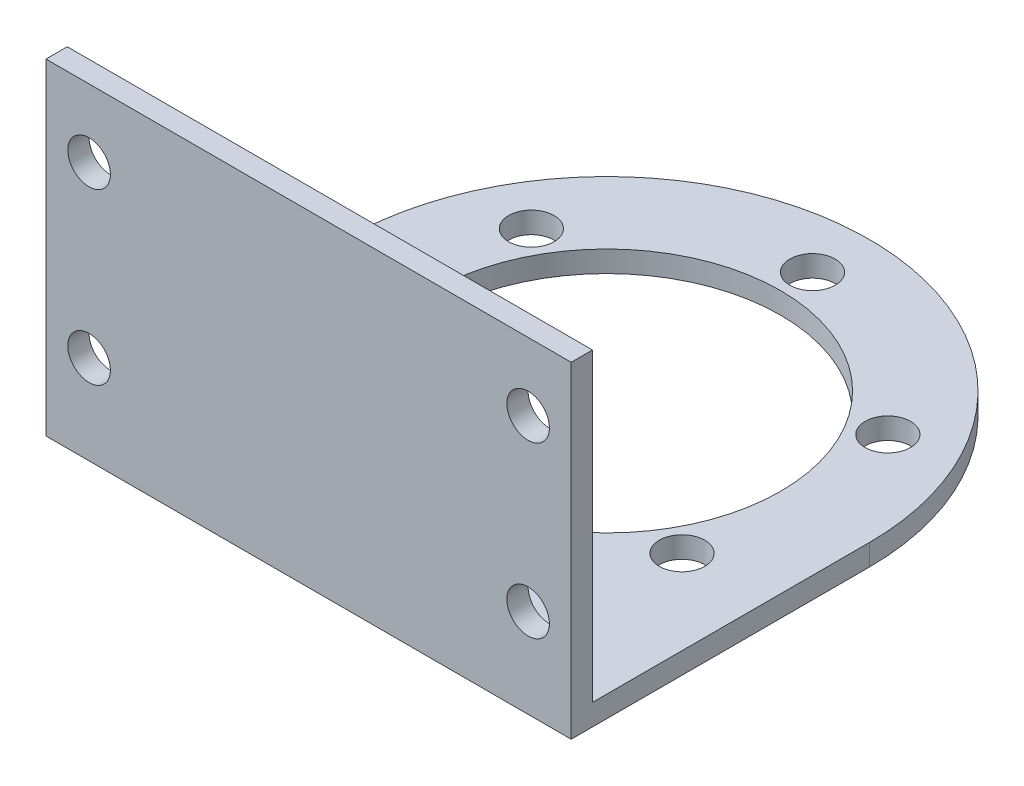
ISO-10303-21;
HEADER;
FILE_DESCRIPTION(('STEP AP214'),'2;1');
FILE_NAME('part.step','',(''),(''),'','','');
FILE_SCHEMA(('AUTOMOTIVE_DESIGN { 1 0 10303 214 1 1 1 1 }'));
ENDSEC;
DATA;
#1=APPLICATION_CONTEXT('core data for automotive mechanical design processes');
#2=APPLICATION_PROTOCOL_DEFINITION('international standard','automotive_design',2000,#1);
#3=PRODUCT_CONTEXT('',#1,'mechanical');
#4=PRODUCT('Part','Part','',(#3));
#5=PRODUCT_RELATED_PRODUCT_CATEGORY('part','',(#4));
#6=PRODUCT_DEFINITION_FORMATION('','',#4);
#7=PRODUCT_DEFINITION_CONTEXT('part definition',#1,'design');
#8=PRODUCT_DEFINITION('design','',#6,#7);
#9=PRODUCT_DEFINITION_SHAPE('','',#8);
#10=(LENGTH_UNIT() NAMED_UNIT(*) SI_UNIT(.MILLI.,.METRE.));
#11=(NAMED_UNIT(*) PLANE_ANGLE_UNIT() SI_UNIT($,.RADIAN.));
#12=(NAMED_UNIT(*) SI_UNIT($,.STERADIAN.) SOLID_ANGLE_UNIT());
#13=UNCERTAINTY_MEASURE_WITH_UNIT(LENGTH_MEASURE(1.E-05),#10,'distance_accuracy_value','');
#14=(GEOMETRIC_REPRESENTATION_CONTEXT(3) GLOBAL_UNCERTAINTY_ASSIGNED_CONTEXT((#13)) GLOBAL_UNIT_ASSIGNED_CONTEXT((#10,
#11,#12)) REPRESENTATION_CONTEXT('',''));
#15=CARTESIAN_POINT('',(0.,0.,0.));
#16=DIRECTION('',(0.,0.,1.));
#17=DIRECTION('',(1.,0.,0.));
#18=AXIS2_PLACEMENT_3D('',#15,#16,#17);
#19=CARTESIAN_POINT('',(-23.3913137520466,1.5,11.9377985524098));
#20=DIRECTION('',(0.,0.,-1.));
#21=DIRECTION('',(-1.,0.,0.));
#22=AXIS2_PLACEMENT_3D('',#19,#20,#21);
#23=PLANE('',#22);
#24=CARTESIAN_POINT('',(-20.3560916593114,18.2203677302584,11.9377985524098));
#25=DIRECTION('',(0.,0.,-1.));
#26=DIRECTION('',(-1.,0.,0.));
#27=AXIS2_PLACEMENT_3D('',#24,#25,#26);
#28=CIRCLE('',#27,1.5);
#29=CARTESIAN_POINT('',(-21.8560916593114,18.2203677302584,11.9377985524098));
#30=VERTEX_POINT('',#29);
#31=EDGE_CURVE('E159',#30,#30,#28,.T.);
#32=ORIENTED_EDGE('',*,*,#31,.T.);
#33=EDGE_LOOP('',(#32));
#34=FACE_BOUND('',#33,.T.);
#35=CARTESIAN_POINT('',(10.5734641552182,6.2796322697416,11.9377985524098));
#36=DIRECTION('',(0.,0.,-1.));
#37=DIRECTION('',(-1.,0.,0.));
#38=AXIS2_PLACEMENT_3D('',#35,#36,#37);
#39=CIRCLE('',#38,1.5);
#40=CARTESIAN_POINT('',(9.0734641552182,6.2796322697416,11.9377985524098));
#41=VERTEX_POINT('',#40);
#42=EDGE_CURVE('E153',#41,#41,#39,.T.);
#43=ORIENTED_EDGE('',*,*,#42,.T.);
#44=EDGE_LOOP('',(#43));
#45=FACE_BOUND('',#44,.T.);
#46=DIRECTION('',(1.,0.,0.));
#47=VECTOR('',#46,1.);
#48=CARTESIAN_POINT('',(-23.3913137520466,0.,11.9377985524098));
#49=LINE('',#48,#47);
#50=CARTESIAN_POINT('',(-23.3913137520466,0.,11.9377985524098));
#51=VERTEX_POINT('',#50);
#52=CARTESIAN_POINT('',(13.6086862479534,0.,11.9377985524098));
#53=VERTEX_POINT('',#52);
#54=EDGE_CURVE('E91',#51,#53,#49,.T.);
#55=ORIENTED_EDGE('',*,*,#54,.T.);
#56=DIRECTION('',(0.,-1.,0.));
#57=VECTOR('',#56,1.);
#58=CARTESIAN_POINT('',(13.6086862479534,1.5,11.9377985524098));
#59=LINE('',#58,#57);
#60=CARTESIAN_POINT('',(13.6086862479534,23.,11.9377985524098));
#61=VERTEX_POINT('',#60);
#62=EDGE_CURVE('E86',#61,#53,#59,.T.);
#63=ORIENTED_EDGE('',*,*,#62,.F.);
#64=DIRECTION('',(1.,0.,0.));
#65=VECTOR('',#64,1.);
#66=CARTESIAN_POINT('',(-23.3913137520466,23.,11.9377985524098));
#67=LINE('',#66,#65);
#68=CARTESIAN_POINT('',(-23.3913137520466,23.,11.9377985524098));
#69=VERTEX_POINT('',#68);
#70=EDGE_CURVE('E168',#69,#61,#67,.T.);
#71=ORIENTED_EDGE('',*,*,#70,.F.);
#72=DIRECTION('',(0.,-1.,0.));
#73=VECTOR('',#72,1.);
#74=CARTESIAN_POINT('',(-23.3913137520466,1.5,11.9377985524098));
#75=LINE('',#74,#73);
#76=EDGE_CURVE('E46',#69,#51,#75,.T.);
#77=ORIENTED_EDGE('',*,*,#76,.T.);
#78=EDGE_LOOP('',(#55,#63,#71,#77));
#79=FACE_BOUND('',#78,.T.);
#80=CARTESIAN_POINT('',(-20.3560916593114,6.2796322697416,11.9377985524098));
#81=DIRECTION('',(0.,0.,-1.));
#82=DIRECTION('',(-1.,0.,0.));
#83=AXIS2_PLACEMENT_3D('',#80,#81,#82);
#84=CIRCLE('',#83,1.5);
#85=CARTESIAN_POINT('',(-21.8560916593114,6.2796322697416,11.9377985524098));
#86=VERTEX_POINT('',#85);
#87=EDGE_CURVE('E156',#86,#86,#84,.F.);
#88=ORIENTED_EDGE('',*,*,#87,.F.);
#89=EDGE_LOOP('',(#88));
#90=FACE_BOUND('',#89,.T.);
#91=CARTESIAN_POINT('',(10.5734641552182,18.2203677302584,11.9377985524098));
#92=DIRECTION('',(0.,0.,-1.));
#93=DIRECTION('',(-1.,0.,0.));
#94=AXIS2_PLACEMENT_3D('',#91,#92,#93);
#95=CIRCLE('',#94,1.5);
#96=CARTESIAN_POINT('',(9.0734641552182,18.2203677302584,11.9377985524098));
#97=VERTEX_POINT('',#96);
#98=EDGE_CURVE('E162',#97,#97,#95,.F.);
#99=ORIENTED_EDGE('',*,*,#98,.F.);
#100=EDGE_LOOP('',(#99));
#101=FACE_BOUND('',#100,.T.);
#102=ADVANCED_FACE('F37',(#34,#45,#79,#90,#101),#23,.F.);
#103=CARTESIAN_POINT('',(-23.3913137520466,23.,10.4377985524098));
#104=DIRECTION('',(0.,0.,1.));
#105=DIRECTION('',(1.,0.,0.));
#106=AXIS2_PLACEMENT_3D('',#103,#104,#105);
#107=PLANE('',#106);
#108=CARTESIAN_POINT('',(-20.3560916593114,18.2203677302584,10.4377985524098));
#109=DIRECTION('',(0.,0.,-1.));
#110=DIRECTION('',(-1.,0.,0.));
#111=AXIS2_PLACEMENT_3D('',#108,#109,#110);
#112=CIRCLE('',#111,1.5);
#113=CARTESIAN_POINT('',(-21.8560916593114,18.2203677302584,10.4377985524098));
#114=VERTEX_POINT('',#113);
#115=EDGE_CURVE('E146',#114,#114,#112,.T.);
#116=ORIENTED_EDGE('',*,*,#115,.F.);
#117=EDGE_LOOP('',(#116));
#118=FACE_BOUND('',#117,.T.);
#119=CARTESIAN_POINT('',(10.5734641552182,6.2796322697416,10.4377985524098));
#120=DIRECTION('',(0.,0.,-1.));
#121=DIRECTION('',(-1.,0.,0.));
#122=AXIS2_PLACEMENT_3D('',#119,#120,#121);
#123=CIRCLE('',#122,1.5);
#124=CARTESIAN_POINT('',(9.0734641552182,6.2796322697416,10.4377985524098));
#125=VERTEX_POINT('',#124);
#126=EDGE_CURVE('E145',#125,#125,#123,.T.);
#127=ORIENTED_EDGE('',*,*,#126,.F.);
#128=EDGE_LOOP('',(#127));
#129=FACE_BOUND('',#128,.T.);
#130=DIRECTION('',(-1.,0.,0.));
#131=VECTOR('',#130,1.);
#132=CARTESIAN_POINT('',(-23.3913137520466,1.5,10.4377985524098));
#133=LINE('',#132,#131);
#134=CARTESIAN_POINT('',(13.6086862479534,1.5,10.4377985524098));
#135=VERTEX_POINT('',#134);
#136=CARTESIAN_POINT('',(-23.3913137520466,1.5,10.4377985524098));
#137=VERTEX_POINT('',#136);
#138=EDGE_CURVE('E54',#135,#137,#133,.T.);
#139=ORIENTED_EDGE('',*,*,#138,.T.);
#140=DIRECTION('',(0.,-1.,0.));
#141=VECTOR('',#140,1.);
#142=CARTESIAN_POINT('',(-23.3913137520466,23.,10.4377985524098));
#143=LINE('',#142,#141);
#144=CARTESIAN_POINT('',(-23.3913137520466,23.,10.4377985524098));
#145=VERTEX_POINT('',#144);
#146=EDGE_CURVE('E177',#145,#137,#143,.T.);
#147=ORIENTED_EDGE('',*,*,#146,.F.);
#148=DIRECTION('',(-1.,0.,0.));
#149=VECTOR('',#148,1.);
#150=CARTESIAN_POINT('',(-23.3913137520466,23.,10.4377985524098));
#151=LINE('',#150,#149);
#152=CARTESIAN_POINT('',(13.6086862479534,23.,10.4377985524098));
#153=VERTEX_POINT('',#152);
#154=EDGE_CURVE('E174',#153,#145,#151,.T.);
#155=ORIENTED_EDGE('',*,*,#154,.F.);
#156=DIRECTION('',(0.,-1.,0.));
#157=VECTOR('',#156,1.);
#158=CARTESIAN_POINT('',(13.6086862479534,23.,10.4377985524098));
#159=LINE('',#158,#157);
#160=EDGE_CURVE('E181',#153,#135,#159,.T.);
#161=ORIENTED_EDGE('',*,*,#160,.T.);
#162=EDGE_LOOP('',(#139,#147,#155,#161));
#163=FACE_BOUND('',#162,.T.);
#164=CARTESIAN_POINT('',(-20.3560916593114,6.2796322697416,10.4377985524098));
#165=DIRECTION('',(0.,0.,-1.));
#166=DIRECTION('',(-1.,0.,0.));
#167=AXIS2_PLACEMENT_3D('',#164,#165,#166);
#168=CIRCLE('',#167,1.5);
#169=CARTESIAN_POINT('',(-21.8560916593114,6.2796322697416,10.4377985524098));
#170=VERTEX_POINT('',#169);
#171=EDGE_CURVE('E142',#170,#170,#168,.F.);
#172=ORIENTED_EDGE('',*,*,#171,.T.);
#173=EDGE_LOOP('',(#172));
#174=FACE_BOUND('',#173,.T.);
#175=CARTESIAN_POINT('',(10.5734641552182,18.2203677302584,10.4377985524098));
#176=DIRECTION('',(0.,0.,-1.));
#177=DIRECTION('',(-1.,0.,0.));
#178=AXIS2_PLACEMENT_3D('',#175,#176,#177);
#179=CIRCLE('',#178,1.5);
#180=CARTESIAN_POINT('',(9.0734641552182,18.2203677302584,10.4377985524098));
#181=VERTEX_POINT('',#180);
#182=EDGE_CURVE('E117',#181,#181,#179,.F.);
#183=ORIENTED_EDGE('',*,*,#182,.T.);
#184=EDGE_LOOP('',(#183));
#185=FACE_BOUND('',#184,.T.);
#186=ADVANCED_FACE('F194',(#118,#129,#163,#174,#185),#107,.F.);
#187=CARTESIAN_POINT('',(-4.89131375204659,1.5,-9.0622014475902));
#188=DIRECTION('',(0.,1.,0.));
#189=DIRECTION('',(0.,0.,1.));
#190=AXIS2_PLACEMENT_3D('',#187,#188,#189);
#191=PLANE('',#190);
#192=CARTESIAN_POINT('',(-17.4486821069209,1.5,-16.3122014475903));
#193=DIRECTION('',(0.,1.,0.));
#194=DIRECTION('',(0.866025403784433,0.,0.50000000000001));
#195=AXIS2_PLACEMENT_3D('',#192,#193,#194);
#196=CIRCLE('',#195,1.6);
#197=CARTESIAN_POINT('',(-16.0630414608658,1.5,-15.5122014475903));
#198=VERTEX_POINT('',#197);
#199=EDGE_CURVE('E395',#198,#198,#196,.T.);
#200=ORIENTED_EDGE('',*,*,#199,.F.);
#201=EDGE_LOOP('',(#200));
#202=FACE_BOUND('',#201,.T.);
#203=CARTESIAN_POINT('',(-17.448682106921,1.5,-1.81220144759031));
#204=DIRECTION('',(0.,1.,0.));
#205=DIRECTION('',(0.866025403784443,0.,-0.499999999999992));
#206=AXIS2_PLACEMENT_3D('',#203,#204,#205);
#207=CIRCLE('',#206,1.6);
#208=CARTESIAN_POINT('',(-16.0630414608659,1.5,-2.6122014475903));
#209=VERTEX_POINT('',#208);
#210=EDGE_CURVE('E396',#209,#209,#207,.T.);
#211=ORIENTED_EDGE('',*,*,#210,.F.);
#212=EDGE_LOOP('',(#211));
#213=FACE_BOUND('',#212,.T.);
#214=CARTESIAN_POINT('',(-4.89131375204659,1.5,5.4377985524098));
#215=DIRECTION('',(0.,1.,0.));
#216=DIRECTION('',(0.,0.,-1.));
#217=AXIS2_PLACEMENT_3D('',#214,#215,#216);
#218=CIRCLE('',#217,1.6);
#219=CARTESIAN_POINT('',(-4.89131375204659,1.5,3.8377985524098));
#220=VERTEX_POINT('',#219);
#221=EDGE_CURVE('E398',#220,#220,#218,.T.);
#222=ORIENTED_EDGE('',*,*,#221,.F.);
#223=EDGE_LOOP('',(#222));
#224=FACE_BOUND('',#223,.T.);
#225=CARTESIAN_POINT('',(7.66605460282774,1.5,-1.81220144759014));
#226=DIRECTION('',(0.,1.,0.));
#227=DIRECTION('',(-0.866025403784436,0.,-0.500000000000004));
#228=AXIS2_PLACEMENT_3D('',#225,#226,#227);
#229=CIRCLE('',#228,1.6);
#230=CARTESIAN_POINT('',(6.28041395677264,1.5,-2.61220144759015));
#231=VERTEX_POINT('',#230);
#232=EDGE_CURVE('E403',#231,#231,#229,.T.);
#233=ORIENTED_EDGE('',*,*,#232,.F.);
#234=EDGE_LOOP('',(#233));
#235=FACE_BOUND('',#234,.T.);
#236=CARTESIAN_POINT('',(7.66605460282779,1.5,-16.3122014475902));
#237=DIRECTION('',(0.,1.,0.));
#238=DIRECTION('',(-0.86602540378444,0.,0.499999999999998));
#239=AXIS2_PLACEMENT_3D('',#236,#237,#238);
#240=CIRCLE('',#239,1.6);
#241=CARTESIAN_POINT('',(6.28041395677269,1.5,-15.5122014475902));
#242=VERTEX_POINT('',#241);
#243=EDGE_CURVE('E123',#242,#242,#240,.T.);
#244=ORIENTED_EDGE('',*,*,#243,.F.);
#245=EDGE_LOOP('',(#244));
#246=FACE_BOUND('',#245,.T.);
#247=CARTESIAN_POINT('',(-4.89131375204659,1.5,-23.5622014475902));
#248=DIRECTION('',(0.,1.,0.));
#249=DIRECTION('',(0.,0.,1.));
#250=AXIS2_PLACEMENT_3D('',#247,#248,#249);
#251=CIRCLE('',#250,1.6);
#252=CARTESIAN_POINT('',(-4.89131375204659,1.5,-21.9622014475902));
#253=VERTEX_POINT('',#252);
#254=EDGE_CURVE('E118',#253,#253,#251,.T.);
#255=ORIENTED_EDGE('',*,*,#254,.F.);
#256=EDGE_LOOP('',(#255));
#257=FACE_BOUND('',#256,.T.);
#258=ORIENTED_EDGE('',*,*,#138,.F.);
#259=DIRECTION('',(0.,0.,-1.));
#260=VECTOR('',#259,1.);
#261=CARTESIAN_POINT('',(13.6086862479534,1.5,-9.0622014475902));
#262=LINE('',#261,#260);
#263=CARTESIAN_POINT('',(13.6086862479534,1.5,-9.0622014475902));
#264=VERTEX_POINT('',#263);
#265=EDGE_CURVE('E59',#135,#264,#262,.T.);
#266=ORIENTED_EDGE('',*,*,#265,.T.);
#267=CARTESIAN_POINT('',(-4.89131375204659,1.5,-9.0622014475902));
#268=DIRECTION('',(0.,1.,0.));
#269=DIRECTION('',(0.,0.,1.));
#270=AXIS2_PLACEMENT_3D('',#267,#268,#269);
#271=CIRCLE('',#270,18.5);
#272=CARTESIAN_POINT('',(-23.3913137520466,1.5,-9.0622014475902));
#273=VERTEX_POINT('',#272);
#274=EDGE_CURVE('E90',#264,#273,#271,.T.);
#275=ORIENTED_EDGE('',*,*,#274,.T.);
#276=DIRECTION('',(0.,0.,1.));
#277=VECTOR('',#276,1.);
#278=CARTESIAN_POINT('',(-23.3913137520466,1.5,-9.0622014475902));
#279=LINE('',#278,#277);
#280=EDGE_CURVE('E186',#273,#137,#279,.T.);
#281=ORIENTED_EDGE('',*,*,#280,.T.);
#282=EDGE_LOOP('',(#258,#266,#275,#281));
#283=FACE_BOUND('',#282,.T.);
#284=CARTESIAN_POINT('',(-4.89131375204659,1.5,-9.0622014475902));
#285=DIRECTION('',(0.,1.,0.));
#286=DIRECTION('',(0.,0.,1.));
#287=AXIS2_PLACEMENT_3D('',#284,#285,#286);
#288=CIRCLE('',#287,12.25);
#289=CARTESIAN_POINT('',(-4.89131375204659,1.5,3.1877985524098));
#290=VERTEX_POINT('',#289);
#291=EDGE_CURVE('E101',#290,#290,#288,.T.);
#292=ORIENTED_EDGE('',*,*,#291,.F.);
#293=EDGE_LOOP('',(#292));
#294=FACE_BOUND('',#293,.T.);
#295=ADVANCED_FACE('F188',(#202,#213,#224,#235,#246,#257,#283,#294),#191,.T.);
#296=CARTESIAN_POINT('',(-4.89131375204659,0.,-9.0622014475902));
#297=DIRECTION('',(0.,1.,0.));
#298=DIRECTION('',(0.,0.,1.));
#299=AXIS2_PLACEMENT_3D('',#296,#297,#298);
#300=PLANE('',#299);
#301=CARTESIAN_POINT('',(-17.4486821069209,0.,-16.3122014475903));
#302=DIRECTION('',(0.,1.,0.));
#303=DIRECTION('',(0.,0.,1.));
#304=AXIS2_PLACEMENT_3D('',#301,#302,#303);
#305=CIRCLE('',#304,1.6);
#306=CARTESIAN_POINT('',(-17.4486821069209,0.,-14.7122014475903));
#307=VERTEX_POINT('',#306);
#308=EDGE_CURVE('E41',#307,#307,#305,.T.);
#309=ORIENTED_EDGE('',*,*,#308,.T.);
#310=EDGE_LOOP('',(#309));
#311=FACE_BOUND('',#310,.T.);
#312=CARTESIAN_POINT('',(-17.448682106921,0.,-1.81220144759031));
#313=DIRECTION('',(0.,1.,0.));
#314=DIRECTION('',(0.,0.,1.));
#315=AXIS2_PLACEMENT_3D('',#312,#313,#314);
#316=CIRCLE('',#315,1.6);
#317=CARTESIAN_POINT('',(-17.448682106921,0.,-0.212201447590311));
#318=VERTEX_POINT('',#317);
#319=EDGE_CURVE('E128',#318,#318,#316,.T.);
#320=ORIENTED_EDGE('',*,*,#319,.T.);
#321=EDGE_LOOP('',(#320));
#322=FACE_BOUND('',#321,.T.);
#323=CARTESIAN_POINT('',(-4.89131375204659,0.,5.4377985524098));
#324=DIRECTION('',(0.,1.,0.));
#325=DIRECTION('',(0.,0.,1.));
#326=AXIS2_PLACEMENT_3D('',#323,#324,#325);
#327=CIRCLE('',#326,1.6);
#328=CARTESIAN_POINT('',(-4.89131375204659,0.,7.0377985524098));
#329=VERTEX_POINT('',#328);
#330=EDGE_CURVE('E126',#329,#329,#327,.T.);
#331=ORIENTED_EDGE('',*,*,#330,.T.);
#332=EDGE_LOOP('',(#331));
#333=FACE_BOUND('',#332,.T.);
#334=CARTESIAN_POINT('',(7.66605460282774,0.,-1.81220144759014));
#335=DIRECTION('',(0.,1.,0.));
#336=DIRECTION('',(0.,0.,1.));
#337=AXIS2_PLACEMENT_3D('',#334,#335,#336);
#338=CIRCLE('',#337,1.6);
#339=CARTESIAN_POINT('',(7.66605460282774,0.,-0.21220144759014));
#340=VERTEX_POINT('',#339);
#341=EDGE_CURVE('E122',#340,#340,#338,.T.);
#342=ORIENTED_EDGE('',*,*,#341,.T.);
#343=EDGE_LOOP('',(#342));
#344=FACE_BOUND('',#343,.T.);
#345=CARTESIAN_POINT('',(7.66605460282779,0.,-16.3122014475902));
#346=DIRECTION('',(0.,1.,0.));
#347=DIRECTION('',(0.,0.,1.));
#348=AXIS2_PLACEMENT_3D('',#345,#346,#347);
#349=CIRCLE('',#348,1.6);
#350=CARTESIAN_POINT('',(7.66605460282779,0.,-14.7122014475902));
#351=VERTEX_POINT('',#350);
#352=EDGE_CURVE('E119',#351,#351,#349,.T.);
#353=ORIENTED_EDGE('',*,*,#352,.T.);
#354=EDGE_LOOP('',(#353));
#355=FACE_BOUND('',#354,.T.);
#356=CARTESIAN_POINT('',(-4.89131375204659,0.,-23.5622014475902));
#357=DIRECTION('',(0.,1.,0.));
#358=DIRECTION('',(0.,0.,1.));
#359=AXIS2_PLACEMENT_3D('',#356,#357,#358);
#360=CIRCLE('',#359,1.6);
#361=CARTESIAN_POINT('',(-4.89131375204659,0.,-21.9622014475902));
#362=VERTEX_POINT('',#361);
#363=EDGE_CURVE('E114',#362,#362,#360,.T.);
#364=ORIENTED_EDGE('',*,*,#363,.T.);
#365=EDGE_LOOP('',(#364));
#366=FACE_BOUND('',#365,.T.);
#367=CARTESIAN_POINT('',(-4.89131375204659,0.,-9.0622014475902));
#368=DIRECTION('',(0.,1.,0.));
#369=DIRECTION('',(0.,0.,1.));
#370=AXIS2_PLACEMENT_3D('',#367,#368,#369);
#371=CIRCLE('',#370,18.5);
#372=CARTESIAN_POINT('',(13.6086862479534,0.,-9.0622014475902));
#373=VERTEX_POINT('',#372);
#374=CARTESIAN_POINT('',(-23.3913137520466,0.,-9.0622014475902));
#375=VERTEX_POINT('',#374);
#376=EDGE_CURVE('E96',#373,#375,#371,.T.);
#377=ORIENTED_EDGE('',*,*,#376,.F.);
#378=DIRECTION('',(0.,0.,-1.));
#379=VECTOR('',#378,1.);
#380=CARTESIAN_POINT('',(13.6086862479534,0.,-9.0622014475902));
#381=LINE('',#380,#379);
#382=EDGE_CURVE('E79',#53,#373,#381,.T.);
#383=ORIENTED_EDGE('',*,*,#382,.F.);
#384=ORIENTED_EDGE('',*,*,#54,.F.);
#385=DIRECTION('',(0.,0.,1.));
#386=VECTOR('',#385,1.);
#387=CARTESIAN_POINT('',(-23.3913137520466,0.,-9.0622014475902));
#388=LINE('',#387,#386);
#389=EDGE_CURVE('E100',#375,#51,#388,.T.);
#390=ORIENTED_EDGE('',*,*,#389,.F.);
#391=EDGE_LOOP('',(#377,#383,#384,#390));
#392=FACE_BOUND('',#391,.T.);
#393=CARTESIAN_POINT('',(-4.89131375204659,0.,-9.0622014475902));
#394=DIRECTION('',(0.,1.,0.));
#395=DIRECTION('',(0.,0.,1.));
#396=AXIS2_PLACEMENT_3D('',#393,#394,#395);
#397=CIRCLE('',#396,12.25);
#398=CARTESIAN_POINT('',(-4.89131375204659,0.,3.1877985524098));
#399=VERTEX_POINT('',#398);
#400=EDGE_CURVE('E105',#399,#399,#397,.T.);
#401=ORIENTED_EDGE('',*,*,#400,.T.);
#402=EDGE_LOOP('',(#401));
#403=FACE_BOUND('',#402,.T.);
#404=ADVANCED_FACE('F98',(#311,#322,#333,#344,#355,#366,#392,#403),#300,.F.);
#405=CARTESIAN_POINT('',(-4.89131375204659,1.5,-9.0622014475902));
#406=DIRECTION('',(0.,-1.,0.));
#407=DIRECTION('',(0.,0.,-1.));
#408=AXIS2_PLACEMENT_3D('',#405,#406,#407);
#409=CYLINDRICAL_SURFACE('',#408,18.5);
#410=ORIENTED_EDGE('',*,*,#376,.T.);
#411=DIRECTION('',(0.,-1.,0.));
#412=VECTOR('',#411,1.);
#413=CARTESIAN_POINT('',(-23.3913137520466,1.5,-9.0622014475902));
#414=LINE('',#413,#412);
#415=EDGE_CURVE('E11',#273,#375,#414,.T.);
#416=ORIENTED_EDGE('',*,*,#415,.F.);
#417=ORIENTED_EDGE('',*,*,#274,.F.);
#418=DIRECTION('',(0.,-1.,0.));
#419=VECTOR('',#418,1.);
#420=CARTESIAN_POINT('',(13.6086862479534,1.5,-9.0622014475902));
#421=LINE('',#420,#419);
#422=EDGE_CURVE('E82',#264,#373,#421,.T.);
#423=ORIENTED_EDGE('',*,*,#422,.T.);
#424=EDGE_LOOP('',(#410,#416,#417,#423));
#425=FACE_BOUND('',#424,.T.);
#426=ADVANCED_FACE('F39',(#425),#409,.T.);
#427=CARTESIAN_POINT('',(-23.3913137520466,1.5,-9.0622014475902));
#428=DIRECTION('',(1.,0.,0.));
#429=DIRECTION('',(0.,0.,-1.));
#430=AXIS2_PLACEMENT_3D('',#427,#428,#429);
#431=PLANE('',#430);
#432=ORIENTED_EDGE('',*,*,#389,.T.);
#433=ORIENTED_EDGE('',*,*,#76,.F.);
#434=DIRECTION('',(0.,0.,1.));
#435=VECTOR('',#434,1.);
#436=CARTESIAN_POINT('',(-23.3913137520466,23.,11.9377985524098));
#437=LINE('',#436,#435);
#438=EDGE_CURVE('E165',#145,#69,#437,.T.);
#439=ORIENTED_EDGE('',*,*,#438,.F.);
#440=ORIENTED_EDGE('',*,*,#146,.T.);
#441=ORIENTED_EDGE('',*,*,#280,.F.);
#442=ORIENTED_EDGE('',*,*,#415,.T.);
#443=EDGE_LOOP('',(#432,#433,#439,#440,#441,#442));
#444=FACE_BOUND('',#443,.T.);
#445=ADVANCED_FACE('F199',(#444),#431,.F.);
#446=CARTESIAN_POINT('',(13.6086862479534,1.5,-9.0622014475902));
#447=DIRECTION('',(-1.,0.,0.));
#448=DIRECTION('',(0.,0.,1.));
#449=AXIS2_PLACEMENT_3D('',#446,#447,#448);
#450=PLANE('',#449);
#451=ORIENTED_EDGE('',*,*,#382,.T.);
#452=ORIENTED_EDGE('',*,*,#422,.F.);
#453=ORIENTED_EDGE('',*,*,#265,.F.);
#454=ORIENTED_EDGE('',*,*,#160,.F.);
#455=DIRECTION('',(0.,0.,-1.));
#456=VECTOR('',#455,1.);
#457=CARTESIAN_POINT('',(13.6086862479534,23.,11.9377985524098));
#458=LINE('',#457,#456);
#459=EDGE_CURVE('E171',#61,#153,#458,.T.);
#460=ORIENTED_EDGE('',*,*,#459,.F.);
#461=ORIENTED_EDGE('',*,*,#62,.T.);
#462=EDGE_LOOP('',(#451,#452,#453,#454,#460,#461));
#463=FACE_BOUND('',#462,.T.);
#464=ADVANCED_FACE('F81',(#463),#450,.F.);
#465=CARTESIAN_POINT('',(-4.89131375204659,1.5,-9.0622014475902));
#466=DIRECTION('',(0.,-1.,0.));
#467=DIRECTION('',(0.,0.,-1.));
#468=AXIS2_PLACEMENT_3D('',#465,#466,#467);
#469=CYLINDRICAL_SURFACE('',#468,12.25);
#470=ORIENTED_EDGE('',*,*,#291,.T.);
#471=EDGE_LOOP('',(#470));
#472=FACE_BOUND('',#471,.T.);
#473=ORIENTED_EDGE('',*,*,#400,.F.);
#474=EDGE_LOOP('',(#473));
#475=FACE_BOUND('',#474,.T.);
#476=ADVANCED_FACE('F243',(#472,#475),#469,.F.);
#477=CARTESIAN_POINT('',(0.,23.,0.));
#478=DIRECTION('',(0.,-1.,0.));
#479=DIRECTION('',(0.,0.,-1.));
#480=AXIS2_PLACEMENT_3D('',#477,#478,#479);
#481=PLANE('',#480);
#482=ORIENTED_EDGE('',*,*,#438,.T.);
#483=ORIENTED_EDGE('',*,*,#70,.T.);
#484=ORIENTED_EDGE('',*,*,#459,.T.);
#485=ORIENTED_EDGE('',*,*,#154,.T.);
#486=EDGE_LOOP('',(#482,#483,#484,#485));
#487=FACE_BOUND('',#486,.T.);
#488=ADVANCED_FACE('F205',(#487),#481,.F.);
#489=CARTESIAN_POINT('',(10.5734641552182,6.2796322697416,20.4377985524098));
#490=DIRECTION('',(0.,0.,-1.));
#491=DIRECTION('',(-1.,0.,0.));
#492=AXIS2_PLACEMENT_3D('',#489,#490,#491);
#493=CYLINDRICAL_SURFACE('',#492,1.5);
#494=ORIENTED_EDGE('',*,*,#126,.T.);
#495=EDGE_LOOP('',(#494));
#496=FACE_BOUND('',#495,.T.);
#497=ORIENTED_EDGE('',*,*,#42,.F.);
#498=EDGE_LOOP('',(#497));
#499=FACE_BOUND('',#498,.T.);
#500=ADVANCED_FACE('F237',(#496,#499),#493,.F.);
#501=CARTESIAN_POINT('',(-20.3560916593114,6.2796322697416,20.4377985524098));
#502=DIRECTION('',(0.,0.,-1.));
#503=DIRECTION('',(-1.,0.,0.));
#504=AXIS2_PLACEMENT_3D('',#501,#502,#503);
#505=CYLINDRICAL_SURFACE('',#504,1.5);
#506=ORIENTED_EDGE('',*,*,#171,.F.);
#507=EDGE_LOOP('',(#506));
#508=FACE_BOUND('',#507,.T.);
#509=ORIENTED_EDGE('',*,*,#87,.T.);
#510=EDGE_LOOP('',(#509));
#511=FACE_BOUND('',#510,.T.);
#512=ADVANCED_FACE('F231',(#508,#511),#505,.F.);
#513=CARTESIAN_POINT('',(-20.3560916593114,18.2203677302584,20.4377985524098));
#514=DIRECTION('',(0.,0.,-1.));
#515=DIRECTION('',(-1.,0.,0.));
#516=AXIS2_PLACEMENT_3D('',#513,#514,#515);
#517=CYLINDRICAL_SURFACE('',#516,1.5);
#518=ORIENTED_EDGE('',*,*,#115,.T.);
#519=EDGE_LOOP('',(#518));
#520=FACE_BOUND('',#519,.T.);
#521=ORIENTED_EDGE('',*,*,#31,.F.);
#522=EDGE_LOOP('',(#521));
#523=FACE_BOUND('',#522,.T.);
#524=ADVANCED_FACE('F222',(#520,#523),#517,.F.);
#525=CARTESIAN_POINT('',(10.5734641552182,18.2203677302584,20.4377985524098));
#526=DIRECTION('',(0.,0.,-1.));
#527=DIRECTION('',(-1.,0.,0.));
#528=AXIS2_PLACEMENT_3D('',#525,#526,#527);
#529=CYLINDRICAL_SURFACE('',#528,1.5);
#530=ORIENTED_EDGE('',*,*,#182,.F.);
#531=EDGE_LOOP('',(#530));
#532=FACE_BOUND('',#531,.T.);
#533=ORIENTED_EDGE('',*,*,#98,.T.);
#534=EDGE_LOOP('',(#533));
#535=FACE_BOUND('',#534,.T.);
#536=ADVANCED_FACE('F219',(#532,#535),#529,.F.);
#537=CARTESIAN_POINT('',(-4.89131375204659,-8.5,-23.5622014475902));
#538=DIRECTION('',(0.,1.,0.));
#539=DIRECTION('',(0.,0.,1.));
#540=AXIS2_PLACEMENT_3D('',#537,#538,#539);
#541=CYLINDRICAL_SURFACE('',#540,1.6);
#542=ORIENTED_EDGE('',*,*,#254,.T.);
#543=EDGE_LOOP('',(#542));
#544=FACE_BOUND('',#543,.T.);
#545=ORIENTED_EDGE('',*,*,#363,.F.);
#546=EDGE_LOOP('',(#545));
#547=FACE_BOUND('',#546,.T.);
#548=ADVANCED_FACE('F221',(#544,#547),#541,.F.);
#549=CARTESIAN_POINT('',(7.66605460282779,-8.5,-16.3122014475902));
#550=DIRECTION('',(0.,1.,0.));
#551=DIRECTION('',(0.,0.,1.));
#552=AXIS2_PLACEMENT_3D('',#549,#550,#551);
#553=CYLINDRICAL_SURFACE('',#552,1.6);
#554=ORIENTED_EDGE('',*,*,#243,.T.);
#555=EDGE_LOOP('',(#554));
#556=FACE_BOUND('',#555,.T.);
#557=ORIENTED_EDGE('',*,*,#352,.F.);
#558=EDGE_LOOP('',(#557));
#559=FACE_BOUND('',#558,.T.);
#560=ADVANCED_FACE('F229',(#556,#559),#553,.F.);
#561=CARTESIAN_POINT('',(7.66605460282774,-8.5,-1.81220144759014));
#562=DIRECTION('',(0.,1.,0.));
#563=DIRECTION('',(0.,0.,1.));
#564=AXIS2_PLACEMENT_3D('',#561,#562,#563);
#565=CYLINDRICAL_SURFACE('',#564,1.6);
#566=ORIENTED_EDGE('',*,*,#232,.T.);
#567=EDGE_LOOP('',(#566));
#568=FACE_BOUND('',#567,.T.);
#569=ORIENTED_EDGE('',*,*,#341,.F.);
#570=EDGE_LOOP('',(#569));
#571=FACE_BOUND('',#570,.T.);
#572=ADVANCED_FACE('F348',(#568,#571),#565,.F.);
#573=CARTESIAN_POINT('',(-4.89131375204659,-8.5,5.4377985524098));
#574=DIRECTION('',(0.,1.,0.));
#575=DIRECTION('',(0.,0.,1.));
#576=AXIS2_PLACEMENT_3D('',#573,#574,#575);
#577=CYLINDRICAL_SURFACE('',#576,1.6);
#578=ORIENTED_EDGE('',*,*,#221,.T.);
#579=EDGE_LOOP('',(#578));
#580=FACE_BOUND('',#579,.T.);
#581=ORIENTED_EDGE('',*,*,#330,.F.);
#582=EDGE_LOOP('',(#581));
#583=FACE_BOUND('',#582,.T.);
#584=ADVANCED_FACE('F355',(#580,#583),#577,.F.);
#585=CARTESIAN_POINT('',(-17.448682106921,-8.5,-1.81220144759031));
#586=DIRECTION('',(0.,1.,0.));
#587=DIRECTION('',(0.,0.,1.));
#588=AXIS2_PLACEMENT_3D('',#585,#586,#587);
#589=CYLINDRICAL_SURFACE('',#588,1.6);
#590=ORIENTED_EDGE('',*,*,#210,.T.);
#591=EDGE_LOOP('',(#590));
#592=FACE_BOUND('',#591,.T.);
#593=ORIENTED_EDGE('',*,*,#319,.F.);
#594=EDGE_LOOP('',(#593));
#595=FACE_BOUND('',#594,.T.);
#596=ADVANCED_FACE('F363',(#592,#595),#589,.F.);
#597=CARTESIAN_POINT('',(-17.4486821069209,-8.5,-16.3122014475903));
#598=DIRECTION('',(0.,1.,0.));
#599=DIRECTION('',(0.,0.,1.));
#600=AXIS2_PLACEMENT_3D('',#597,#598,#599);
#601=CYLINDRICAL_SURFACE('',#600,1.6);
#602=ORIENTED_EDGE('',*,*,#199,.T.);
#603=EDGE_LOOP('',(#602));
#604=FACE_BOUND('',#603,.T.);
#605=ORIENTED_EDGE('',*,*,#308,.F.);
#606=EDGE_LOOP('',(#605));
#607=FACE_BOUND('',#606,.T.);
#608=ADVANCED_FACE('F371',(#604,#607),#601,.F.);
#609=CLOSED_SHELL('',(#102,#186,#295,#404,#426,#445,#464,#476,#488,#500,#512,#524,#536,#548,
#560,#572,#584,#596,#608));
#610=MANIFOLD_SOLID_BREP('B2',#609);
#611=ADVANCED_BREP_SHAPE_REPRESENTATION('',(#18,#610),#14);
#612=SHAPE_DEFINITION_REPRESENTATION(#9,#611);
ENDSEC;
END-ISO-10303-21;
